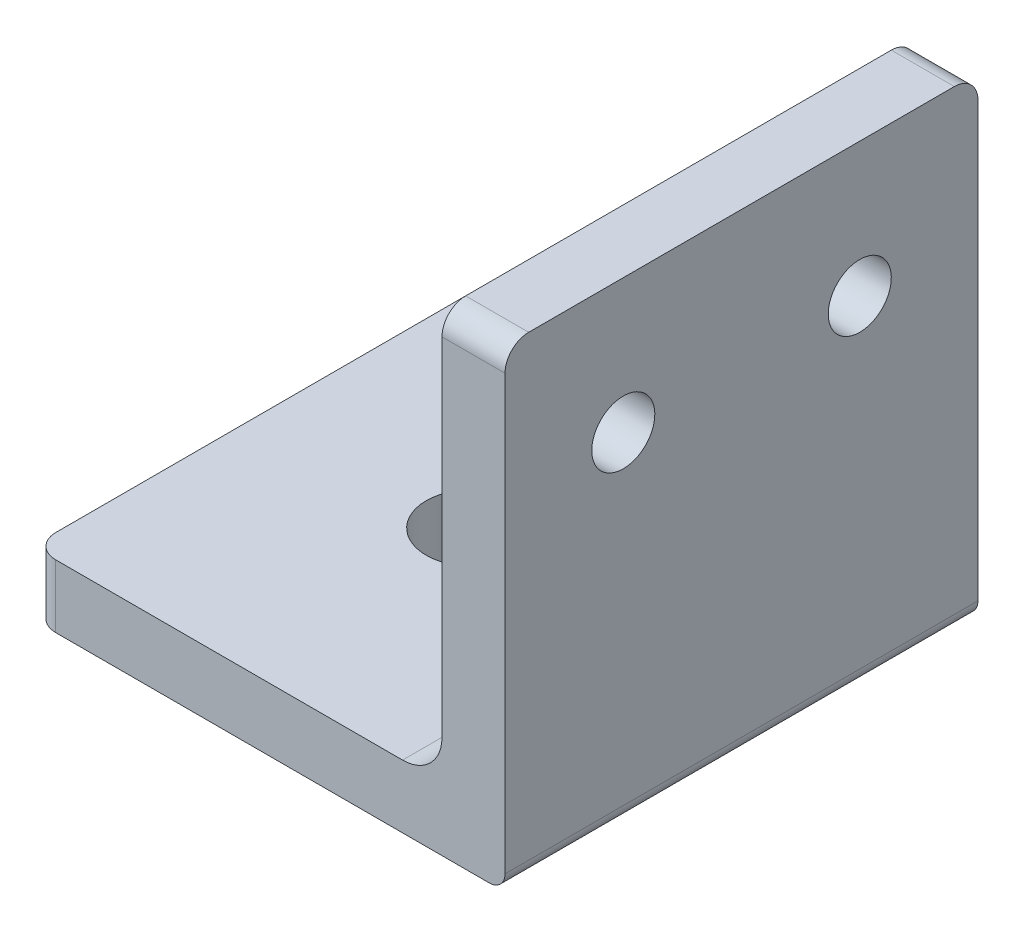
ISO-10303-21;
HEADER;
FILE_DESCRIPTION(('STEP AP214'),'2;1');
FILE_NAME('part.step','',(''),(''),'','','');
FILE_SCHEMA(('AUTOMOTIVE_DESIGN { 1 0 10303 214 1 1 1 1 }'));
ENDSEC;
DATA;
#1=APPLICATION_CONTEXT('core data for automotive mechanical design processes');
#2=APPLICATION_PROTOCOL_DEFINITION('international standard','automotive_design',2000,#1);
#3=PRODUCT_CONTEXT('',#1,'mechanical');
#4=PRODUCT('Part','Part','',(#3));
#5=PRODUCT_RELATED_PRODUCT_CATEGORY('part','',(#4));
#6=PRODUCT_DEFINITION_FORMATION('','',#4);
#7=PRODUCT_DEFINITION_CONTEXT('part definition',#1,'design');
#8=PRODUCT_DEFINITION('design','',#6,#7);
#9=PRODUCT_DEFINITION_SHAPE('','',#8);
#10=(LENGTH_UNIT() NAMED_UNIT(*) SI_UNIT(.MILLI.,.METRE.));
#11=(NAMED_UNIT(*) PLANE_ANGLE_UNIT() SI_UNIT($,.RADIAN.));
#12=(NAMED_UNIT(*) SI_UNIT($,.STERADIAN.) SOLID_ANGLE_UNIT());
#13=UNCERTAINTY_MEASURE_WITH_UNIT(LENGTH_MEASURE(1.E-05),#10,'distance_accuracy_value','');
#14=(GEOMETRIC_REPRESENTATION_CONTEXT(3) GLOBAL_UNCERTAINTY_ASSIGNED_CONTEXT((#13)) GLOBAL_UNIT_ASSIGNED_CONTEXT((#10,
#11,#12)) REPRESENTATION_CONTEXT('',''));
#15=CARTESIAN_POINT('',(0.,0.,0.));
#16=DIRECTION('',(0.,0.,1.));
#17=DIRECTION('',(1.,0.,0.));
#18=AXIS2_PLACEMENT_3D('',#15,#16,#17);
#19=CARTESIAN_POINT('',(0.,52.,60.));
#20=DIRECTION('',(1.,0.,0.));
#21=DIRECTION('',(0.,1.,0.));
#22=AXIS2_PLACEMENT_3D('',#19,#20,#21);
#23=PLANE('',#22);
#24=CARTESIAN_POINT('',(0.,35.,15.));
#25=DIRECTION('',(-1.,0.,0.));
#26=DIRECTION('',(0.,-1.,0.));
#27=AXIS2_PLACEMENT_3D('',#24,#25,#26);
#28=CIRCLE('',#27,4.);
#29=CARTESIAN_POINT('',(0.,31.,15.));
#30=VERTEX_POINT('',#29);
#31=EDGE_CURVE('E186',#30,#30,#28,.T.);
#32=ORIENTED_EDGE('',*,*,#31,.F.);
#33=EDGE_LOOP('',(#32));
#34=FACE_BOUND('',#33,.T.);
#35=CARTESIAN_POINT('',(0.,35.,45.));
#36=DIRECTION('',(-1.,0.,0.));
#37=DIRECTION('',(0.,1.,0.));
#38=AXIS2_PLACEMENT_3D('',#35,#36,#37);
#39=CIRCLE('',#38,3.99999999999999);
#40=CARTESIAN_POINT('',(0.,39.,45.));
#41=VERTEX_POINT('',#40);
#42=EDGE_CURVE('E162',#41,#41,#39,.T.);
#43=ORIENTED_EDGE('',*,*,#42,.F.);
#44=EDGE_LOOP('',(#43));
#45=FACE_BOUND('',#44,.T.);
#46=DIRECTION('',(0.,-1.,0.));
#47=VECTOR('',#46,1.);
#48=CARTESIAN_POINT('',(0.,52.,0.));
#49=LINE('',#48,#47);
#50=CARTESIAN_POINT('',(0.,49.,0.));
#51=VERTEX_POINT('',#50);
#52=CARTESIAN_POINT('',(0.,5.,0.));
#53=VERTEX_POINT('',#52);
#54=EDGE_CURVE('E166',#51,#53,#49,.T.);
#55=ORIENTED_EDGE('',*,*,#54,.T.);
#56=DIRECTION('',(0.,0.,-1.));
#57=VECTOR('',#56,1.);
#58=CARTESIAN_POINT('',(0.,5.,60.));
#59=LINE('',#58,#57);
#60=CARTESIAN_POINT('',(0.,5.,60.));
#61=VERTEX_POINT('',#60);
#62=EDGE_CURVE('E152',#53,#61,#59,.F.);
#63=ORIENTED_EDGE('',*,*,#62,.T.);
#64=DIRECTION('',(0.,-1.,0.));
#65=VECTOR('',#64,1.);
#66=CARTESIAN_POINT('',(0.,52.,60.));
#67=LINE('',#66,#65);
#68=CARTESIAN_POINT('',(0.,49.,60.));
#69=VERTEX_POINT('',#68);
#70=EDGE_CURVE('E145',#69,#61,#67,.T.);
#71=ORIENTED_EDGE('',*,*,#70,.F.);
#72=CARTESIAN_POINT('',(0.,49.,57.));
#73=DIRECTION('',(1.,0.,0.));
#74=DIRECTION('',(0.,1.,0.));
#75=AXIS2_PLACEMENT_3D('',#72,#73,#74);
#76=CIRCLE('',#75,3.);
#77=CARTESIAN_POINT('',(0.,52.,57.));
#78=VERTEX_POINT('',#77);
#79=EDGE_CURVE('E126',#69,#78,#76,.F.);
#80=ORIENTED_EDGE('',*,*,#79,.T.);
#81=DIRECTION('',(0.,0.,-1.));
#82=VECTOR('',#81,1.);
#83=CARTESIAN_POINT('',(0.,52.,60.));
#84=LINE('',#83,#82);
#85=CARTESIAN_POINT('',(0.,52.,3.));
#86=VERTEX_POINT('',#85);
#87=EDGE_CURVE('E169',#78,#86,#84,.T.);
#88=ORIENTED_EDGE('',*,*,#87,.T.);
#89=CARTESIAN_POINT('',(0.,49.,3.));
#90=DIRECTION('',(1.,0.,0.));
#91=DIRECTION('',(0.,1.,0.));
#92=AXIS2_PLACEMENT_3D('',#89,#90,#91);
#93=CIRCLE('',#92,3.);
#94=EDGE_CURVE('E136',#86,#51,#93,.F.);
#95=ORIENTED_EDGE('',*,*,#94,.T.);
#96=EDGE_LOOP('',(#55,#63,#71,#80,#88,#95));
#97=FACE_BOUND('',#96,.T.);
#98=ADVANCED_FACE('F39',(#34,#45,#97),#23,.F.);
#99=CARTESIAN_POINT('',(0.,0.,60.));
#100=DIRECTION('',(0.,-1.,0.));
#101=DIRECTION('',(1.,0.,0.));
#102=AXIS2_PLACEMENT_3D('',#99,#100,#101);
#103=PLANE('',#102);
#104=CARTESIAN_POINT('',(-26.,0.,30.));
#105=DIRECTION('',(0.,1.,0.));
#106=DIRECTION('',(-1.,0.,0.));
#107=AXIS2_PLACEMENT_3D('',#104,#105,#106);
#108=CIRCLE('',#107,6.);
#109=CARTESIAN_POINT('',(-32.,0.,30.));
#110=VERTEX_POINT('',#109);
#111=EDGE_CURVE('E195',#110,#110,#108,.T.);
#112=ORIENTED_EDGE('',*,*,#111,.F.);
#113=EDGE_LOOP('',(#112));
#114=FACE_BOUND('',#113,.T.);
#115=DIRECTION('',(-1.,0.,0.));
#116=VECTOR('',#115,1.);
#117=CARTESIAN_POINT('',(0.,0.,60.));
#118=LINE('',#117,#116);
#119=CARTESIAN_POINT('',(-5.,0.,60.));
#120=VERTEX_POINT('',#119);
#121=CARTESIAN_POINT('',(-49.,0.,60.));
#122=VERTEX_POINT('',#121);
#123=EDGE_CURVE('E154',#120,#122,#118,.T.);
#124=ORIENTED_EDGE('',*,*,#123,.F.);
#125=DIRECTION('',(0.,0.,-1.));
#126=VECTOR('',#125,1.);
#127=CARTESIAN_POINT('',(-5.,0.,0.));
#128=LINE('',#127,#126);
#129=CARTESIAN_POINT('',(-5.,0.,0.));
#130=VERTEX_POINT('',#129);
#131=EDGE_CURVE('E221',#120,#130,#128,.T.);
#132=ORIENTED_EDGE('',*,*,#131,.T.);
#133=DIRECTION('',(-1.,0.,0.));
#134=VECTOR('',#133,1.);
#135=CARTESIAN_POINT('',(0.,0.,0.));
#136=LINE('',#135,#134);
#137=CARTESIAN_POINT('',(-49.,0.,0.));
#138=VERTEX_POINT('',#137);
#139=EDGE_CURVE('E174',#130,#138,#136,.T.);
#140=ORIENTED_EDGE('',*,*,#139,.T.);
#141=CARTESIAN_POINT('',(-49.,0.,3.));
#142=DIRECTION('',(0.,-1.,0.));
#143=DIRECTION('',(1.,0.,0.));
#144=AXIS2_PLACEMENT_3D('',#141,#142,#143);
#145=CIRCLE('',#144,3.);
#146=CARTESIAN_POINT('',(-52.,0.,3.));
#147=VERTEX_POINT('',#146);
#148=EDGE_CURVE('E202',#138,#147,#145,.F.);
#149=ORIENTED_EDGE('',*,*,#148,.T.);
#150=DIRECTION('',(0.,0.,-1.));
#151=VECTOR('',#150,1.);
#152=CARTESIAN_POINT('',(-52.,0.,60.));
#153=LINE('',#152,#151);
#154=CARTESIAN_POINT('',(-52.,0.,57.));
#155=VERTEX_POINT('',#154);
#156=EDGE_CURVE('E147',#155,#147,#153,.T.);
#157=ORIENTED_EDGE('',*,*,#156,.F.);
#158=CARTESIAN_POINT('',(-49.,0.,57.));
#159=DIRECTION('',(0.,-1.,0.));
#160=DIRECTION('',(1.,0.,0.));
#161=AXIS2_PLACEMENT_3D('',#158,#159,#160);
#162=CIRCLE('',#161,3.);
#163=EDGE_CURVE('E210',#155,#122,#162,.F.);
#164=ORIENTED_EDGE('',*,*,#163,.T.);
#165=EDGE_LOOP('',(#124,#132,#140,#149,#157,#164));
#166=FACE_BOUND('',#165,.T.);
#167=ADVANCED_FACE('F254',(#114,#166),#103,.F.);
#168=CARTESIAN_POINT('',(-52.,0.,60.));
#169=DIRECTION('',(1.,0.,0.));
#170=DIRECTION('',(0.,0.,-1.));
#171=AXIS2_PLACEMENT_3D('',#168,#169,#170);
#172=PLANE('',#171);
#173=DIRECTION('',(0.,0.,-1.));
#174=VECTOR('',#173,1.);
#175=CARTESIAN_POINT('',(-52.,-8.00000000000001,60.));
#176=LINE('',#175,#174);
#177=CARTESIAN_POINT('',(-52.,-8.00000000000001,57.));
#178=VERTEX_POINT('',#177);
#179=CARTESIAN_POINT('',(-52.,-8.00000000000001,3.));
#180=VERTEX_POINT('',#179);
#181=EDGE_CURVE('E179',#178,#180,#176,.T.);
#182=ORIENTED_EDGE('',*,*,#181,.F.);
#183=DIRECTION('',(0.,-1.,0.));
#184=VECTOR('',#183,1.);
#185=CARTESIAN_POINT('',(-52.,0.,57.));
#186=LINE('',#185,#184);
#187=EDGE_CURVE('E201',#178,#155,#186,.F.);
#188=ORIENTED_EDGE('',*,*,#187,.T.);
#189=ORIENTED_EDGE('',*,*,#156,.T.);
#190=DIRECTION('',(0.,-1.,0.));
#191=VECTOR('',#190,1.);
#192=CARTESIAN_POINT('',(-52.,-8.00000000000001,3.));
#193=LINE('',#192,#191);
#194=EDGE_CURVE('E199',#147,#180,#193,.T.);
#195=ORIENTED_EDGE('',*,*,#194,.T.);
#196=EDGE_LOOP('',(#182,#188,#189,#195));
#197=FACE_BOUND('',#196,.T.);
#198=ADVANCED_FACE('F266',(#197),#172,.F.);
#199=CARTESIAN_POINT('',(-52.,-8.00000000000001,60.));
#200=DIRECTION('',(0.,1.,0.));
#201=DIRECTION('',(-1.,0.,0.));
#202=AXIS2_PLACEMENT_3D('',#199,#200,#201);
#203=PLANE('',#202);
#204=CARTESIAN_POINT('',(-26.,-8.00000000000001,30.));
#205=DIRECTION('',(0.,1.,0.));
#206=DIRECTION('',(-1.,0.,0.));
#207=AXIS2_PLACEMENT_3D('',#204,#205,#206);
#208=CIRCLE('',#207,6.);
#209=CARTESIAN_POINT('',(-32.,-8.00000000000001,30.));
#210=VERTEX_POINT('',#209);
#211=EDGE_CURVE('E187',#210,#210,#208,.T.);
#212=ORIENTED_EDGE('',*,*,#211,.T.);
#213=EDGE_LOOP('',(#212));
#214=FACE_BOUND('',#213,.T.);
#215=DIRECTION('',(1.,0.,0.));
#216=VECTOR('',#215,1.);
#217=CARTESIAN_POINT('',(-52.,-8.00000000000001,0.));
#218=LINE('',#217,#216);
#219=CARTESIAN_POINT('',(-49.,-8.00000000000001,0.));
#220=VERTEX_POINT('',#219);
#221=CARTESIAN_POINT('',(5.99999999999998,-8.,0.));
#222=VERTEX_POINT('',#221);
#223=EDGE_CURVE('E159',#220,#222,#218,.T.);
#224=ORIENTED_EDGE('',*,*,#223,.T.);
#225=DIRECTION('',(0.,0.,-1.));
#226=VECTOR('',#225,1.);
#227=CARTESIAN_POINT('',(6.,-8.,60.));
#228=LINE('',#227,#226);
#229=CARTESIAN_POINT('',(5.99999999999998,-8.,60.));
#230=VERTEX_POINT('',#229);
#231=EDGE_CURVE('E50',#222,#230,#228,.F.);
#232=ORIENTED_EDGE('',*,*,#231,.T.);
#233=DIRECTION('',(1.,0.,0.));
#234=VECTOR('',#233,1.);
#235=CARTESIAN_POINT('',(-52.,-8.00000000000001,60.));
#236=LINE('',#235,#234);
#237=CARTESIAN_POINT('',(-49.,-8.00000000000001,60.));
#238=VERTEX_POINT('',#237);
#239=EDGE_CURVE('E158',#238,#230,#236,.T.);
#240=ORIENTED_EDGE('',*,*,#239,.F.);
#241=CARTESIAN_POINT('',(-49.,-8.00000000000001,57.));
#242=DIRECTION('',(0.,1.,0.));
#243=DIRECTION('',(-1.,0.,0.));
#244=AXIS2_PLACEMENT_3D('',#241,#242,#243);
#245=CIRCLE('',#244,3.);
#246=EDGE_CURVE('E196',#238,#178,#245,.F.);
#247=ORIENTED_EDGE('',*,*,#246,.T.);
#248=ORIENTED_EDGE('',*,*,#181,.T.);
#249=CARTESIAN_POINT('',(-49.,-8.00000000000001,3.));
#250=DIRECTION('',(0.,1.,0.));
#251=DIRECTION('',(-1.,0.,0.));
#252=AXIS2_PLACEMENT_3D('',#249,#250,#251);
#253=CIRCLE('',#252,3.);
#254=EDGE_CURVE('E198',#180,#220,#253,.F.);
#255=ORIENTED_EDGE('',*,*,#254,.T.);
#256=EDGE_LOOP('',(#224,#232,#240,#247,#248,#255));
#257=FACE_BOUND('',#256,.T.);
#258=ADVANCED_FACE('F263',(#214,#257),#203,.F.);
#259=CARTESIAN_POINT('',(7.99999999999999,-8.,60.));
#260=DIRECTION('',(-1.,0.,0.));
#261=DIRECTION('',(0.,-1.,0.));
#262=AXIS2_PLACEMENT_3D('',#259,#260,#261);
#263=PLANE('',#262);
#264=CARTESIAN_POINT('',(7.99999999999999,35.,15.));
#265=DIRECTION('',(-1.,0.,0.));
#266=DIRECTION('',(0.,-1.,0.));
#267=AXIS2_PLACEMENT_3D('',#264,#265,#266);
#268=CIRCLE('',#267,4.);
#269=CARTESIAN_POINT('',(7.99999999999999,31.,15.));
#270=VERTEX_POINT('',#269);
#271=EDGE_CURVE('E171',#270,#270,#268,.T.);
#272=ORIENTED_EDGE('',*,*,#271,.T.);
#273=EDGE_LOOP('',(#272));
#274=FACE_BOUND('',#273,.T.);
#275=CARTESIAN_POINT('',(7.99999999999999,35.,45.));
#276=DIRECTION('',(-1.,0.,0.));
#277=DIRECTION('',(0.,-1.,0.));
#278=AXIS2_PLACEMENT_3D('',#275,#276,#277);
#279=CIRCLE('',#278,3.99999999999999);
#280=CARTESIAN_POINT('',(7.99999999999999,31.,45.));
#281=VERTEX_POINT('',#280);
#282=EDGE_CURVE('E184',#281,#281,#279,.T.);
#283=ORIENTED_EDGE('',*,*,#282,.T.);
#284=EDGE_LOOP('',(#283));
#285=FACE_BOUND('',#284,.T.);
#286=DIRECTION('',(0.,1.,0.));
#287=VECTOR('',#286,1.);
#288=CARTESIAN_POINT('',(7.99999999999999,-8.,60.));
#289=LINE('',#288,#287);
#290=CARTESIAN_POINT('',(7.99999999999999,-6.,60.));
#291=VERTEX_POINT('',#290);
#292=CARTESIAN_POINT('',(8.,49.,60.));
#293=VERTEX_POINT('',#292);
#294=EDGE_CURVE('E150',#291,#293,#289,.T.);
#295=ORIENTED_EDGE('',*,*,#294,.F.);
#296=DIRECTION('',(0.,0.,-1.));
#297=VECTOR('',#296,1.);
#298=CARTESIAN_POINT('',(7.99999999999999,-6.,60.));
#299=LINE('',#298,#297);
#300=CARTESIAN_POINT('',(7.99999999999999,-6.,0.));
#301=VERTEX_POINT('',#300);
#302=EDGE_CURVE('E235',#291,#301,#299,.T.);
#303=ORIENTED_EDGE('',*,*,#302,.T.);
#304=DIRECTION('',(0.,1.,0.));
#305=VECTOR('',#304,1.);
#306=CARTESIAN_POINT('',(7.99999999999999,-8.,0.));
#307=LINE('',#306,#305);
#308=CARTESIAN_POINT('',(8.,49.,0.));
#309=VERTEX_POINT('',#308);
#310=EDGE_CURVE('E156',#301,#309,#307,.T.);
#311=ORIENTED_EDGE('',*,*,#310,.T.);
#312=CARTESIAN_POINT('',(8.,49.,3.));
#313=DIRECTION('',(-1.,0.,0.));
#314=DIRECTION('',(0.,-1.,0.));
#315=AXIS2_PLACEMENT_3D('',#312,#313,#314);
#316=CIRCLE('',#315,3.);
#317=CARTESIAN_POINT('',(8.,52.,3.));
#318=VERTEX_POINT('',#317);
#319=EDGE_CURVE('E225',#309,#318,#316,.F.);
#320=ORIENTED_EDGE('',*,*,#319,.T.);
#321=DIRECTION('',(0.,0.,-1.));
#322=VECTOR('',#321,1.);
#323=CARTESIAN_POINT('',(8.,52.,60.));
#324=LINE('',#323,#322);
#325=CARTESIAN_POINT('',(8.,52.,57.));
#326=VERTEX_POINT('',#325);
#327=EDGE_CURVE('E178',#326,#318,#324,.T.);
#328=ORIENTED_EDGE('',*,*,#327,.F.);
#329=CARTESIAN_POINT('',(8.,49.,57.));
#330=DIRECTION('',(-1.,0.,0.));
#331=DIRECTION('',(0.,-1.,0.));
#332=AXIS2_PLACEMENT_3D('',#329,#330,#331);
#333=CIRCLE('',#332,3.);
#334=EDGE_CURVE('E219',#326,#293,#333,.F.);
#335=ORIENTED_EDGE('',*,*,#334,.T.);
#336=EDGE_LOOP('',(#295,#303,#311,#320,#328,#335));
#337=FACE_BOUND('',#336,.T.);
#338=ADVANCED_FACE('F240',(#274,#285,#337),#263,.F.);
#339=CARTESIAN_POINT('',(8.,52.,60.));
#340=DIRECTION('',(0.,-1.,0.));
#341=DIRECTION('',(0.,0.,-1.));
#342=AXIS2_PLACEMENT_3D('',#339,#340,#341);
#343=PLANE('',#342);
#344=ORIENTED_EDGE('',*,*,#327,.T.);
#345=DIRECTION('',(-1.,0.,0.));
#346=VECTOR('',#345,1.);
#347=CARTESIAN_POINT('',(0.,52.,3.));
#348=LINE('',#347,#346);
#349=EDGE_CURVE('E139',#318,#86,#348,.T.);
#350=ORIENTED_EDGE('',*,*,#349,.T.);
#351=ORIENTED_EDGE('',*,*,#87,.F.);
#352=DIRECTION('',(-1.,0.,0.));
#353=VECTOR('',#352,1.);
#354=CARTESIAN_POINT('',(8.,52.,57.));
#355=LINE('',#354,#353);
#356=EDGE_CURVE('E135',#78,#326,#355,.F.);
#357=ORIENTED_EDGE('',*,*,#356,.T.);
#358=EDGE_LOOP('',(#344,#350,#351,#357));
#359=FACE_BOUND('',#358,.T.);
#360=ADVANCED_FACE('F249',(#359),#343,.F.);
#361=CARTESIAN_POINT('',(0.,0.,60.));
#362=DIRECTION('',(0.,0.,-1.));
#363=DIRECTION('',(-1.,0.,0.));
#364=AXIS2_PLACEMENT_3D('',#361,#362,#363);
#365=PLANE('',#364);
#366=ORIENTED_EDGE('',*,*,#239,.T.);
#367=CARTESIAN_POINT('',(5.99999999999999,-6.,60.));
#368=DIRECTION('',(0.,0.,-1.));
#369=DIRECTION('',(-1.,0.,0.));
#370=AXIS2_PLACEMENT_3D('',#367,#368,#369);
#371=CIRCLE('',#370,2.);
#372=EDGE_CURVE('E11',#230,#291,#371,.F.);
#373=ORIENTED_EDGE('',*,*,#372,.T.);
#374=ORIENTED_EDGE('',*,*,#294,.T.);
#375=DIRECTION('',(-1.,0.,0.));
#376=VECTOR('',#375,1.);
#377=CARTESIAN_POINT('',(0.,49.,60.));
#378=LINE('',#377,#376);
#379=EDGE_CURVE('E131',#293,#69,#378,.T.);
#380=ORIENTED_EDGE('',*,*,#379,.T.);
#381=ORIENTED_EDGE('',*,*,#70,.T.);
#382=CARTESIAN_POINT('',(-5.,5.,60.));
#383=DIRECTION('',(0.,0.,-1.));
#384=DIRECTION('',(-1.,0.,0.));
#385=AXIS2_PLACEMENT_3D('',#382,#383,#384);
#386=CIRCLE('',#385,5.);
#387=EDGE_CURVE('E227',#61,#120,#386,.T.);
#388=ORIENTED_EDGE('',*,*,#387,.T.);
#389=ORIENTED_EDGE('',*,*,#123,.T.);
#390=DIRECTION('',(0.,-1.,0.));
#391=VECTOR('',#390,1.);
#392=CARTESIAN_POINT('',(-49.,0.,60.));
#393=LINE('',#392,#391);
#394=EDGE_CURVE('E149',#122,#238,#393,.T.);
#395=ORIENTED_EDGE('',*,*,#394,.T.);
#396=EDGE_LOOP('',(#366,#373,#374,#380,#381,#388,#389,#395));
#397=FACE_BOUND('',#396,.T.);
#398=ADVANCED_FACE('F141',(#397),#365,.F.);
#399=CARTESIAN_POINT('',(0.,0.,0.));
#400=DIRECTION('',(0.,0.,-1.));
#401=DIRECTION('',(-1.,0.,0.));
#402=AXIS2_PLACEMENT_3D('',#399,#400,#401);
#403=PLANE('',#402);
#404=ORIENTED_EDGE('',*,*,#310,.F.);
#405=CARTESIAN_POINT('',(5.99999999999999,-6.,0.));
#406=DIRECTION('',(0.,0.,-1.));
#407=DIRECTION('',(-1.,0.,0.));
#408=AXIS2_PLACEMENT_3D('',#405,#406,#407);
#409=CIRCLE('',#408,2.);
#410=EDGE_CURVE('E64',#301,#222,#409,.T.);
#411=ORIENTED_EDGE('',*,*,#410,.T.);
#412=ORIENTED_EDGE('',*,*,#223,.F.);
#413=DIRECTION('',(0.,-1.,0.));
#414=VECTOR('',#413,1.);
#415=CARTESIAN_POINT('',(-49.,0.,0.));
#416=LINE('',#415,#414);
#417=EDGE_CURVE('E213',#220,#138,#416,.F.);
#418=ORIENTED_EDGE('',*,*,#417,.T.);
#419=ORIENTED_EDGE('',*,*,#139,.F.);
#420=CARTESIAN_POINT('',(-5.,5.,0.));
#421=DIRECTION('',(0.,0.,-1.));
#422=DIRECTION('',(-1.,0.,0.));
#423=AXIS2_PLACEMENT_3D('',#420,#421,#422);
#424=CIRCLE('',#423,5.);
#425=EDGE_CURVE('E230',#130,#53,#424,.F.);
#426=ORIENTED_EDGE('',*,*,#425,.T.);
#427=ORIENTED_EDGE('',*,*,#54,.F.);
#428=DIRECTION('',(-1.,0.,0.));
#429=VECTOR('',#428,1.);
#430=CARTESIAN_POINT('',(8.,49.,0.));
#431=LINE('',#430,#429);
#432=EDGE_CURVE('E209',#51,#309,#431,.F.);
#433=ORIENTED_EDGE('',*,*,#432,.T.);
#434=EDGE_LOOP('',(#404,#411,#412,#418,#419,#426,#427,#433));
#435=FACE_BOUND('',#434,.T.);
#436=ADVANCED_FACE('F238',(#435),#403,.T.);
#437=CARTESIAN_POINT('',(60.,35.,45.));
#438=DIRECTION('',(-1.,0.,0.));
#439=DIRECTION('',(0.,-1.,0.));
#440=AXIS2_PLACEMENT_3D('',#437,#438,#439);
#441=CYLINDRICAL_SURFACE('',#440,3.99999999999999);
#442=ORIENTED_EDGE('',*,*,#42,.T.);
#443=EDGE_LOOP('',(#442));
#444=FACE_BOUND('',#443,.T.);
#445=ORIENTED_EDGE('',*,*,#282,.F.);
#446=EDGE_LOOP('',(#445));
#447=FACE_BOUND('',#446,.T.);
#448=ADVANCED_FACE('F346',(#444,#447),#441,.F.);
#449=CARTESIAN_POINT('',(60.,35.,15.));
#450=DIRECTION('',(-1.,0.,0.));
#451=DIRECTION('',(0.,-1.,0.));
#452=AXIS2_PLACEMENT_3D('',#449,#450,#451);
#453=CYLINDRICAL_SURFACE('',#452,4.);
#454=ORIENTED_EDGE('',*,*,#31,.T.);
#455=EDGE_LOOP('',(#454));
#456=FACE_BOUND('',#455,.T.);
#457=ORIENTED_EDGE('',*,*,#271,.F.);
#458=EDGE_LOOP('',(#457));
#459=FACE_BOUND('',#458,.T.);
#460=ADVANCED_FACE('F338',(#456,#459),#453,.F.);
#461=CARTESIAN_POINT('',(-26.,-60.,30.));
#462=DIRECTION('',(0.,1.,0.));
#463=DIRECTION('',(-1.,0.,0.));
#464=AXIS2_PLACEMENT_3D('',#461,#462,#463);
#465=CYLINDRICAL_SURFACE('',#464,6.);
#466=ORIENTED_EDGE('',*,*,#111,.T.);
#467=EDGE_LOOP('',(#466));
#468=FACE_BOUND('',#467,.T.);
#469=ORIENTED_EDGE('',*,*,#211,.F.);
#470=EDGE_LOOP('',(#469));
#471=FACE_BOUND('',#470,.T.);
#472=ADVANCED_FACE('F295',(#468,#471),#465,.F.);
#473=CARTESIAN_POINT('',(-49.,0.,57.));
#474=DIRECTION('',(0.,-1.,0.));
#475=DIRECTION('',(0.,0.,-1.));
#476=AXIS2_PLACEMENT_3D('',#473,#474,#475);
#477=CYLINDRICAL_SURFACE('',#476,3.);
#478=ORIENTED_EDGE('',*,*,#163,.F.);
#479=ORIENTED_EDGE('',*,*,#187,.F.);
#480=ORIENTED_EDGE('',*,*,#246,.F.);
#481=ORIENTED_EDGE('',*,*,#394,.F.);
#482=EDGE_LOOP('',(#478,#479,#480,#481));
#483=FACE_BOUND('',#482,.T.);
#484=ADVANCED_FACE('F265',(#483),#477,.T.);
#485=CARTESIAN_POINT('',(-49.,0.,3.));
#486=DIRECTION('',(0.,1.,0.));
#487=DIRECTION('',(0.,0.,1.));
#488=AXIS2_PLACEMENT_3D('',#485,#486,#487);
#489=CYLINDRICAL_SURFACE('',#488,3.);
#490=ORIENTED_EDGE('',*,*,#148,.F.);
#491=ORIENTED_EDGE('',*,*,#417,.F.);
#492=ORIENTED_EDGE('',*,*,#254,.F.);
#493=ORIENTED_EDGE('',*,*,#194,.F.);
#494=EDGE_LOOP('',(#490,#491,#492,#493));
#495=FACE_BOUND('',#494,.T.);
#496=ADVANCED_FACE('F269',(#495),#489,.T.);
#497=CARTESIAN_POINT('',(8.,49.,3.));
#498=DIRECTION('',(1.,0.,0.));
#499=DIRECTION('',(0.,0.,-1.));
#500=AXIS2_PLACEMENT_3D('',#497,#498,#499);
#501=CYLINDRICAL_SURFACE('',#500,3.);
#502=ORIENTED_EDGE('',*,*,#319,.F.);
#503=ORIENTED_EDGE('',*,*,#432,.F.);
#504=ORIENTED_EDGE('',*,*,#94,.F.);
#505=ORIENTED_EDGE('',*,*,#349,.F.);
#506=EDGE_LOOP('',(#502,#503,#504,#505));
#507=FACE_BOUND('',#506,.T.);
#508=ADVANCED_FACE('F248',(#507),#501,.T.);
#509=CARTESIAN_POINT('',(0.,49.,57.));
#510=DIRECTION('',(-1.,0.,0.));
#511=DIRECTION('',(0.,0.,1.));
#512=AXIS2_PLACEMENT_3D('',#509,#510,#511);
#513=CYLINDRICAL_SURFACE('',#512,3.);
#514=ORIENTED_EDGE('',*,*,#334,.F.);
#515=ORIENTED_EDGE('',*,*,#356,.F.);
#516=ORIENTED_EDGE('',*,*,#79,.F.);
#517=ORIENTED_EDGE('',*,*,#379,.F.);
#518=EDGE_LOOP('',(#514,#515,#516,#517));
#519=FACE_BOUND('',#518,.T.);
#520=ADVANCED_FACE('F134',(#519),#513,.T.);
#521=CARTESIAN_POINT('',(-5.,5.,60.));
#522=DIRECTION('',(0.,0.,1.));
#523=DIRECTION('',(1.,0.,0.));
#524=AXIS2_PLACEMENT_3D('',#521,#522,#523);
#525=CYLINDRICAL_SURFACE('',#524,5.);
#526=ORIENTED_EDGE('',*,*,#387,.F.);
#527=ORIENTED_EDGE('',*,*,#62,.F.);
#528=ORIENTED_EDGE('',*,*,#425,.F.);
#529=ORIENTED_EDGE('',*,*,#131,.F.);
#530=EDGE_LOOP('',(#526,#527,#528,#529));
#531=FACE_BOUND('',#530,.T.);
#532=ADVANCED_FACE('F253',(#531),#525,.F.);
#533=CARTESIAN_POINT('',(5.99999999999999,-6.,60.));
#534=DIRECTION('',(0.,0.,-1.));
#535=DIRECTION('',(-1.,0.,0.));
#536=AXIS2_PLACEMENT_3D('',#533,#534,#535);
#537=CYLINDRICAL_SURFACE('',#536,2.);
#538=ORIENTED_EDGE('',*,*,#372,.F.);
#539=ORIENTED_EDGE('',*,*,#231,.F.);
#540=ORIENTED_EDGE('',*,*,#410,.F.);
#541=ORIENTED_EDGE('',*,*,#302,.F.);
#542=EDGE_LOOP('',(#538,#539,#540,#541));
#543=FACE_BOUND('',#542,.T.);
#544=ADVANCED_FACE('F41',(#543),#537,.T.);
#545=CLOSED_SHELL('',(#98,#167,#198,#258,#338,#360,#398,#436,#448,#460,#472,#484,#496,#508,#520,
#532,#544));
#546=MANIFOLD_SOLID_BREP('B2',#545);
#547=ADVANCED_BREP_SHAPE_REPRESENTATION('',(#18,#546),#14);
#548=SHAPE_DEFINITION_REPRESENTATION(#9,#547);
ENDSEC;
END-ISO-10303-21;
